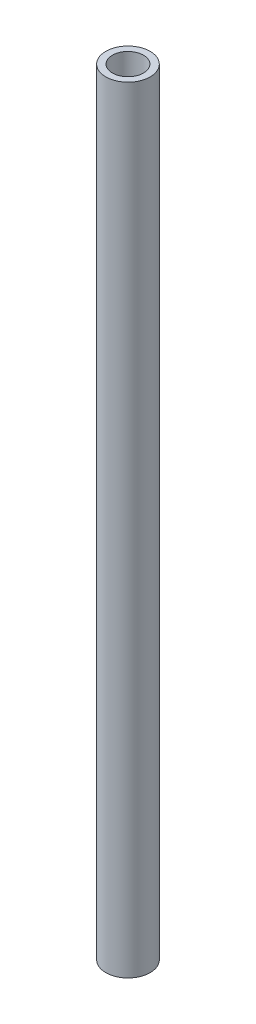
ISO-10303-21;
HEADER;
FILE_DESCRIPTION(('STEP AP214'),'2;1');
FILE_NAME('part.step','',(''),(''),'','','');
FILE_SCHEMA(('AUTOMOTIVE_DESIGN { 1 0 10303 214 1 1 1 1 }'));
ENDSEC;
DATA;
#1=APPLICATION_CONTEXT('core data for automotive mechanical design processes');
#2=APPLICATION_PROTOCOL_DEFINITION('international standard','automotive_design',2000,#1);
#3=PRODUCT_CONTEXT('',#1,'mechanical');
#4=PRODUCT('Part','Part','',(#3));
#5=PRODUCT_RELATED_PRODUCT_CATEGORY('part','',(#4));
#6=PRODUCT_DEFINITION_FORMATION('','',#4);
#7=PRODUCT_DEFINITION_CONTEXT('part definition',#1,'design');
#8=PRODUCT_DEFINITION('design','',#6,#7);
#9=PRODUCT_DEFINITION_SHAPE('','',#8);
#10=(LENGTH_UNIT() NAMED_UNIT(*) SI_UNIT(.MILLI.,.METRE.));
#11=(NAMED_UNIT(*) PLANE_ANGLE_UNIT() SI_UNIT($,.RADIAN.));
#12=(NAMED_UNIT(*) SI_UNIT($,.STERADIAN.) SOLID_ANGLE_UNIT());
#13=UNCERTAINTY_MEASURE_WITH_UNIT(LENGTH_MEASURE(1.E-05),#10,'distance_accuracy_value','');
#14=(GEOMETRIC_REPRESENTATION_CONTEXT(3) GLOBAL_UNCERTAINTY_ASSIGNED_CONTEXT((#13)) GLOBAL_UNIT_ASSIGNED_CONTEXT((#10,
#11,#12)) REPRESENTATION_CONTEXT('',''));
#15=CARTESIAN_POINT('',(0.,0.,0.));
#16=DIRECTION('',(0.,0.,1.));
#17=DIRECTION('',(1.,0.,0.));
#18=AXIS2_PLACEMENT_3D('',#15,#16,#17);
#19=CARTESIAN_POINT('',(0.,350.,0.));
#20=DIRECTION('',(0.,1.,0.));
#21=DIRECTION('',(0.,0.,1.));
#22=AXIS2_PLACEMENT_3D('',#19,#20,#21);
#23=PLANE('',#22);
#24=CARTESIAN_POINT('',(0.,350.,0.));
#25=DIRECTION('',(0.,1.,0.));
#26=DIRECTION('',(0.,0.,1.));
#27=AXIS2_PLACEMENT_3D('',#24,#25,#26);
#28=CIRCLE('',#27,10.);
#29=CARTESIAN_POINT('',(0.,350.,10.));
#30=VERTEX_POINT('',#29);
#31=EDGE_CURVE('E11',#30,#30,#28,.T.);
#32=ORIENTED_EDGE('',*,*,#31,.T.);
#33=EDGE_LOOP('',(#32));
#34=FACE_BOUND('',#33,.T.);
#35=CARTESIAN_POINT('',(0.,350.,0.));
#36=DIRECTION('',(0.,1.,0.));
#37=DIRECTION('',(1.,0.,0.));
#38=AXIS2_PLACEMENT_3D('',#35,#36,#37);
#39=CIRCLE('',#38,7.);
#40=CARTESIAN_POINT('',(7.,350.,0.));
#41=VERTEX_POINT('',#40);
#42=EDGE_CURVE('E56',#41,#41,#39,.T.);
#43=ORIENTED_EDGE('',*,*,#42,.F.);
#44=EDGE_LOOP('',(#43));
#45=FACE_BOUND('',#44,.T.);
#46=ADVANCED_FACE('F43',(#34,#45),#23,.T.);
#47=CARTESIAN_POINT('',(0.,0.,0.));
#48=DIRECTION('',(0.,1.,0.));
#49=DIRECTION('',(0.,0.,1.));
#50=AXIS2_PLACEMENT_3D('',#47,#48,#49);
#51=PLANE('',#50);
#52=CARTESIAN_POINT('',(0.,0.,0.));
#53=DIRECTION('',(0.,1.,0.));
#54=DIRECTION('',(0.,0.,1.));
#55=AXIS2_PLACEMENT_3D('',#52,#53,#54);
#56=CIRCLE('',#55,10.);
#57=CARTESIAN_POINT('',(0.,0.,10.));
#58=VERTEX_POINT('',#57);
#59=EDGE_CURVE('E47',#58,#58,#56,.T.);
#60=ORIENTED_EDGE('',*,*,#59,.F.);
#61=EDGE_LOOP('',(#60));
#62=FACE_BOUND('',#61,.T.);
#63=CARTESIAN_POINT('',(0.,0.,0.));
#64=DIRECTION('',(0.,1.,0.));
#65=DIRECTION('',(1.,0.,0.));
#66=AXIS2_PLACEMENT_3D('',#63,#64,#65);
#67=CIRCLE('',#66,7.);
#68=CARTESIAN_POINT('',(7.,0.,0.));
#69=VERTEX_POINT('',#68);
#70=EDGE_CURVE('E58',#69,#69,#67,.T.);
#71=ORIENTED_EDGE('',*,*,#70,.T.);
#72=EDGE_LOOP('',(#71));
#73=FACE_BOUND('',#72,.T.);
#74=ADVANCED_FACE('F70',(#62,#73),#51,.F.);
#75=CARTESIAN_POINT('',(0.,350.,0.));
#76=DIRECTION('',(0.,-1.,0.));
#77=DIRECTION('',(0.,0.,-1.));
#78=AXIS2_PLACEMENT_3D('',#75,#76,#77);
#79=CYLINDRICAL_SURFACE('',#78,10.);
#80=ORIENTED_EDGE('',*,*,#31,.F.);
#81=EDGE_LOOP('',(#80));
#82=FACE_BOUND('',#81,.T.);
#83=ORIENTED_EDGE('',*,*,#59,.T.);
#84=EDGE_LOOP('',(#83));
#85=FACE_BOUND('',#84,.T.);
#86=ADVANCED_FACE('F45',(#82,#85),#79,.T.);
#87=CARTESIAN_POINT('',(0.,350.,0.));
#88=DIRECTION('',(0.,-1.,0.));
#89=DIRECTION('',(0.,0.,-1.));
#90=AXIS2_PLACEMENT_3D('',#87,#88,#89);
#91=CYLINDRICAL_SURFACE('',#90,7.);
#92=ORIENTED_EDGE('',*,*,#42,.T.);
#93=EDGE_LOOP('',(#92));
#94=FACE_BOUND('',#93,.T.);
#95=ORIENTED_EDGE('',*,*,#70,.F.);
#96=EDGE_LOOP('',(#95));
#97=FACE_BOUND('',#96,.T.);
#98=ADVANCED_FACE('F66',(#94,#97),#91,.F.);
#99=CLOSED_SHELL('',(#46,#74,#86,#98));
#100=MANIFOLD_SOLID_BREP('B2',#99);
#101=ADVANCED_BREP_SHAPE_REPRESENTATION('',(#18,#100),#14);
#102=SHAPE_DEFINITION_REPRESENTATION(#9,#101);
ENDSEC;
END-ISO-10303-21;
